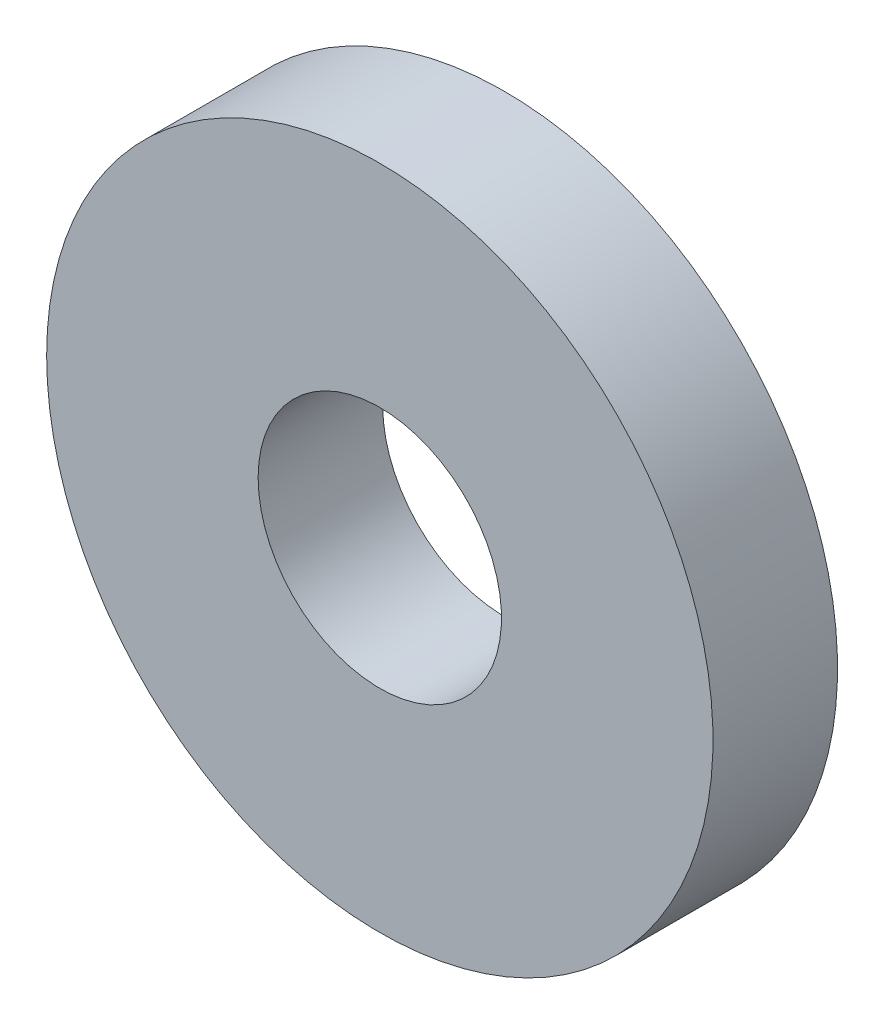
ISO-10303-21;
HEADER;
FILE_DESCRIPTION(('STEP AP214'),'2;1');
FILE_NAME('part.step','',(''),(''),'','','');
FILE_SCHEMA(('AUTOMOTIVE_DESIGN { 1 0 10303 214 1 1 1 1 }'));
ENDSEC;
DATA;
#1=APPLICATION_CONTEXT('core data for automotive mechanical design processes');
#2=APPLICATION_PROTOCOL_DEFINITION('international standard','automotive_design',2000,#1);
#3=PRODUCT_CONTEXT('',#1,'mechanical');
#4=PRODUCT('Part','Part','',(#3));
#5=PRODUCT_RELATED_PRODUCT_CATEGORY('part','',(#4));
#6=PRODUCT_DEFINITION_FORMATION('','',#4);
#7=PRODUCT_DEFINITION_CONTEXT('part definition',#1,'design');
#8=PRODUCT_DEFINITION('design','',#6,#7);
#9=PRODUCT_DEFINITION_SHAPE('','',#8);
#10=(LENGTH_UNIT() NAMED_UNIT(*) SI_UNIT(.MILLI.,.METRE.));
#11=(NAMED_UNIT(*) PLANE_ANGLE_UNIT() SI_UNIT($,.RADIAN.));
#12=(NAMED_UNIT(*) SI_UNIT($,.STERADIAN.) SOLID_ANGLE_UNIT());
#13=UNCERTAINTY_MEASURE_WITH_UNIT(LENGTH_MEASURE(1.E-05),#10,'distance_accuracy_value','');
#14=(GEOMETRIC_REPRESENTATION_CONTEXT(3) GLOBAL_UNCERTAINTY_ASSIGNED_CONTEXT((#13)) GLOBAL_UNIT_ASSIGNED_CONTEXT((#10,
#11,#12)) REPRESENTATION_CONTEXT('',''));
#15=CARTESIAN_POINT('',(0.,0.,0.));
#16=DIRECTION('',(0.,0.,1.));
#17=DIRECTION('',(1.,0.,0.));
#18=AXIS2_PLACEMENT_3D('',#15,#16,#17);
#19=CARTESIAN_POINT('',(0.,0.,4.3));
#20=DIRECTION('',(0.,0.,1.));
#21=DIRECTION('',(1.,0.,0.));
#22=AXIS2_PLACEMENT_3D('',#19,#20,#21);
#23=PLANE('',#22);
#24=CARTESIAN_POINT('',(0.,0.,4.3));
#25=DIRECTION('',(0.,0.,1.));
#26=DIRECTION('',(1.,0.,0.));
#27=AXIS2_PLACEMENT_3D('',#24,#25,#26);
#28=CIRCLE('',#27,11.5);
#29=CARTESIAN_POINT('',(-11.5,0.,4.3));
#30=VERTEX_POINT('',#29);
#31=EDGE_CURVE('E10',#30,#30,#28,.T.);
#32=ORIENTED_EDGE('',*,*,#31,.T.);
#33=EDGE_LOOP('',(#32));
#34=FACE_BOUND('',#33,.T.);
#35=CARTESIAN_POINT('',(0.,0.,4.3));
#36=DIRECTION('',(0.,0.,1.));
#37=DIRECTION('',(1.,0.,0.));
#38=AXIS2_PLACEMENT_3D('',#35,#36,#37);
#39=CIRCLE('',#38,4.2);
#40=CARTESIAN_POINT('',(-4.2,0.,4.3));
#41=VERTEX_POINT('',#40);
#42=EDGE_CURVE('E41',#41,#41,#39,.T.);
#43=ORIENTED_EDGE('',*,*,#42,.F.);
#44=EDGE_LOOP('',(#43));
#45=FACE_BOUND('',#44,.T.);
#46=ADVANCED_FACE('F30',(#34,#45),#23,.T.);
#47=CARTESIAN_POINT('',(0.,0.,0.));
#48=DIRECTION('',(0.,0.,1.));
#49=DIRECTION('',(1.,0.,0.));
#50=AXIS2_PLACEMENT_3D('',#47,#48,#49);
#51=PLANE('',#50);
#52=CARTESIAN_POINT('',(0.,0.,0.));
#53=DIRECTION('',(0.,0.,1.));
#54=DIRECTION('',(1.,0.,0.));
#55=AXIS2_PLACEMENT_3D('',#52,#53,#54);
#56=CIRCLE('',#55,11.5);
#57=CARTESIAN_POINT('',(-11.5,0.,0.));
#58=VERTEX_POINT('',#57);
#59=EDGE_CURVE('E34',#58,#58,#56,.T.);
#60=ORIENTED_EDGE('',*,*,#59,.F.);
#61=EDGE_LOOP('',(#60));
#62=FACE_BOUND('',#61,.T.);
#63=CARTESIAN_POINT('',(0.,0.,0.));
#64=DIRECTION('',(0.,0.,1.));
#65=DIRECTION('',(1.,0.,0.));
#66=AXIS2_PLACEMENT_3D('',#63,#64,#65);
#67=CIRCLE('',#66,4.2);
#68=CARTESIAN_POINT('',(-4.2,0.,0.));
#69=VERTEX_POINT('',#68);
#70=EDGE_CURVE('E43',#69,#69,#67,.T.);
#71=ORIENTED_EDGE('',*,*,#70,.T.);
#72=EDGE_LOOP('',(#71));
#73=FACE_BOUND('',#72,.T.);
#74=ADVANCED_FACE('F53',(#62,#73),#51,.F.);
#75=CARTESIAN_POINT('',(0.,0.,4.3));
#76=DIRECTION('',(0.,0.,-1.));
#77=DIRECTION('',(-1.,0.,0.));
#78=AXIS2_PLACEMENT_3D('',#75,#76,#77);
#79=CYLINDRICAL_SURFACE('',#78,11.5);
#80=CARTESIAN_POINT('',(-11.5,0.,4.3));
#81=CARTESIAN_POINT('',(-11.5,0.,4.25520833333333));
#82=CARTESIAN_POINT('',(-11.5,0.,4.21041666666667));
#83=CARTESIAN_POINT('',(-11.5,0.,4.12083333333333));
#84=CARTESIAN_POINT('',(-11.5,0.,4.07604166666667));
#85=CARTESIAN_POINT('',(-11.5,0.,3.98645833333333));
#86=CARTESIAN_POINT('',(-11.5,0.,3.94166666666667));
#87=CARTESIAN_POINT('',(-11.5,0.,3.85208333333333));
#88=CARTESIAN_POINT('',(-11.5,0.,3.80729166666667));
#89=CARTESIAN_POINT('',(-11.5,0.,3.71770833333333));
#90=CARTESIAN_POINT('',(-11.5,0.,3.67291666666667));
#91=CARTESIAN_POINT('',(-11.5,0.,3.58333333333333));
#92=CARTESIAN_POINT('',(-11.5,0.,3.53854166666667));
#93=CARTESIAN_POINT('',(-11.5,0.,3.44895833333333));
#94=CARTESIAN_POINT('',(-11.5,0.,3.40416666666667));
#95=CARTESIAN_POINT('',(-11.5,0.,3.31458333333333));
#96=CARTESIAN_POINT('',(-11.5,0.,3.26979166666667));
#97=CARTESIAN_POINT('',(-11.5,0.,3.18020833333333));
#98=CARTESIAN_POINT('',(-11.5,0.,3.13541666666667));
#99=CARTESIAN_POINT('',(-11.5,0.,3.04583333333333));
#100=CARTESIAN_POINT('',(-11.5,0.,3.00104166666667));
#101=CARTESIAN_POINT('',(-11.5,0.,2.91145833333333));
#102=CARTESIAN_POINT('',(-11.5,0.,2.86666666666667));
#103=CARTESIAN_POINT('',(-11.5,0.,2.77708333333333));
#104=CARTESIAN_POINT('',(-11.5,0.,2.73229166666667));
#105=CARTESIAN_POINT('',(-11.5,0.,2.64270833333333));
#106=CARTESIAN_POINT('',(-11.5,0.,2.59791666666667));
#107=CARTESIAN_POINT('',(-11.5,0.,2.50833333333333));
#108=CARTESIAN_POINT('',(-11.5,0.,2.46354166666667));
#109=CARTESIAN_POINT('',(-11.5,0.,2.37395833333333));
#110=CARTESIAN_POINT('',(-11.5,0.,2.32916666666667));
#111=CARTESIAN_POINT('',(-11.5,0.,2.23958333333333));
#112=CARTESIAN_POINT('',(-11.5,0.,2.19479166666667));
#113=CARTESIAN_POINT('',(-11.5,0.,2.10520833333333));
#114=CARTESIAN_POINT('',(-11.5,0.,2.06041666666667));
#115=CARTESIAN_POINT('',(-11.5,0.,1.97083333333333));
#116=CARTESIAN_POINT('',(-11.5,0.,1.92604166666667));
#117=CARTESIAN_POINT('',(-11.5,0.,1.83645833333333));
#118=CARTESIAN_POINT('',(-11.5,0.,1.79166666666667));
#119=CARTESIAN_POINT('',(-11.5,0.,1.70208333333333));
#120=CARTESIAN_POINT('',(-11.5,0.,1.65729166666667));
#121=CARTESIAN_POINT('',(-11.5,0.,1.56770833333333));
#122=CARTESIAN_POINT('',(-11.5,0.,1.52291666666667));
#123=CARTESIAN_POINT('',(-11.5,0.,1.43333333333333));
#124=CARTESIAN_POINT('',(-11.5,0.,1.38854166666667));
#125=CARTESIAN_POINT('',(-11.5,0.,1.29895833333333));
#126=CARTESIAN_POINT('',(-11.5,0.,1.25416666666667));
#127=CARTESIAN_POINT('',(-11.5,0.,1.16458333333333));
#128=CARTESIAN_POINT('',(-11.5,0.,1.11979166666667));
#129=CARTESIAN_POINT('',(-11.5,0.,1.03020833333333));
#130=CARTESIAN_POINT('',(-11.5,0.,0.985416666666665));
#131=CARTESIAN_POINT('',(-11.5,0.,0.895833333333332));
#132=CARTESIAN_POINT('',(-11.5,0.,0.851041666666665));
#133=CARTESIAN_POINT('',(-11.5,0.,0.761458333333332));
#134=CARTESIAN_POINT('',(-11.5,0.,0.716666666666665));
#135=CARTESIAN_POINT('',(-11.5,0.,0.627083333333332));
#136=CARTESIAN_POINT('',(-11.5,0.,0.582291666666665));
#137=CARTESIAN_POINT('',(-11.5,0.,0.492708333333332));
#138=CARTESIAN_POINT('',(-11.5,0.,0.447916666666665));
#139=CARTESIAN_POINT('',(-11.5,0.,0.358333333333332));
#140=CARTESIAN_POINT('',(-11.5,0.,0.313541666666666));
#141=CARTESIAN_POINT('',(-11.5,0.,0.223958333333332));
#142=CARTESIAN_POINT('',(-11.5,0.,0.179166666666666));
#143=CARTESIAN_POINT('',(-11.5,0.,0.0895833333333324));
#144=CARTESIAN_POINT('',(-11.5,0.,0.0447916666666658));
#145=CARTESIAN_POINT('',(-11.5,0.,0.));
#146=B_SPLINE_CURVE_WITH_KNOTS('',3,(#80,#81,#82,#83,#84,#85,#86,#87,#88,#89,#90,#91,#92,#93,
#94,#95,#96,#97,#98,#99,#100,#101,#102,#103,#104,#105,#106,#107,#108,#109,#110,#111,#112,#113,
#114,#115,#116,#117,#118,#119,#120,#121,#122,#123,#124,#125,#126,#127,#128,#129,#130,#131,#132,
#133,#134,#135,#136,#137,#138,#139,#140,#141,#142,#143,#144,#145),.UNSPECIFIED.,.F.,.F.,(4,2,2,
2,2,2,2,2,2,2,2,2,2,2,2,2,2,2,2,2,2,2,2,2,2,2,2,2,2,2,2,2,4),(0.,0.134375000000001,
0.268750000000001,0.403125000000001,0.537500000000001,0.671875000000001,0.806250000000001,
0.940625,1.075,1.209375,1.34375,1.478125,1.6125,1.746875,1.88125,2.015625,2.15,2.284375,2.41875,
2.553125,2.6875,2.821875,2.95625,3.090625,3.225,3.359375,3.49375,3.628125,3.7625,3.896875,
4.03125,4.165625,4.3),.UNSPECIFIED.);
#147=EDGE_CURVE('BSEAM32',#30,#58,#146,.T.);
#148=ORIENTED_EDGE('',*,*,#31,.F.);
#149=ORIENTED_EDGE('',*,*,#59,.T.);
#150=ORIENTED_EDGE('',*,*,#147,.T.);
#151=ORIENTED_EDGE('',*,*,#147,.F.);
#152=EDGE_LOOP('',(#148,#150,#149,#151));
#153=FACE_BOUND('',#152,.T.);
#154=ADVANCED_FACE('F32',(#153),#79,.T.);
#155=CARTESIAN_POINT('',(0.,0.,4.3));
#156=DIRECTION('',(0.,0.,-1.));
#157=DIRECTION('',(-1.,0.,0.));
#158=AXIS2_PLACEMENT_3D('',#155,#156,#157);
#159=CYLINDRICAL_SURFACE('',#158,4.2);
#160=CARTESIAN_POINT('',(-4.2,0.,4.3));
#161=CARTESIAN_POINT('',(-4.2,0.,4.25520833333333));
#162=CARTESIAN_POINT('',(-4.2,0.,4.21041666666667));
#163=CARTESIAN_POINT('',(-4.2,0.,4.12083333333333));
#164=CARTESIAN_POINT('',(-4.2,0.,4.07604166666667));
#165=CARTESIAN_POINT('',(-4.2,0.,3.98645833333333));
#166=CARTESIAN_POINT('',(-4.2,0.,3.94166666666667));
#167=CARTESIAN_POINT('',(-4.2,0.,3.85208333333333));
#168=CARTESIAN_POINT('',(-4.2,0.,3.80729166666667));
#169=CARTESIAN_POINT('',(-4.2,0.,3.71770833333333));
#170=CARTESIAN_POINT('',(-4.2,0.,3.67291666666667));
#171=CARTESIAN_POINT('',(-4.2,0.,3.58333333333333));
#172=CARTESIAN_POINT('',(-4.2,0.,3.53854166666667));
#173=CARTESIAN_POINT('',(-4.2,0.,3.44895833333333));
#174=CARTESIAN_POINT('',(-4.2,0.,3.40416666666667));
#175=CARTESIAN_POINT('',(-4.2,0.,3.31458333333333));
#176=CARTESIAN_POINT('',(-4.2,0.,3.26979166666667));
#177=CARTESIAN_POINT('',(-4.2,0.,3.18020833333333));
#178=CARTESIAN_POINT('',(-4.2,0.,3.13541666666667));
#179=CARTESIAN_POINT('',(-4.2,0.,3.04583333333333));
#180=CARTESIAN_POINT('',(-4.2,0.,3.00104166666667));
#181=CARTESIAN_POINT('',(-4.2,0.,2.91145833333333));
#182=CARTESIAN_POINT('',(-4.2,0.,2.86666666666667));
#183=CARTESIAN_POINT('',(-4.2,0.,2.77708333333333));
#184=CARTESIAN_POINT('',(-4.2,0.,2.73229166666667));
#185=CARTESIAN_POINT('',(-4.2,0.,2.64270833333333));
#186=CARTESIAN_POINT('',(-4.2,0.,2.59791666666667));
#187=CARTESIAN_POINT('',(-4.2,0.,2.50833333333333));
#188=CARTESIAN_POINT('',(-4.2,0.,2.46354166666667));
#189=CARTESIAN_POINT('',(-4.2,0.,2.37395833333333));
#190=CARTESIAN_POINT('',(-4.2,0.,2.32916666666667));
#191=CARTESIAN_POINT('',(-4.2,0.,2.23958333333333));
#192=CARTESIAN_POINT('',(-4.2,0.,2.19479166666667));
#193=CARTESIAN_POINT('',(-4.2,0.,2.10520833333333));
#194=CARTESIAN_POINT('',(-4.2,0.,2.06041666666667));
#195=CARTESIAN_POINT('',(-4.2,0.,1.97083333333333));
#196=CARTESIAN_POINT('',(-4.2,0.,1.92604166666667));
#197=CARTESIAN_POINT('',(-4.2,0.,1.83645833333333));
#198=CARTESIAN_POINT('',(-4.2,0.,1.79166666666667));
#199=CARTESIAN_POINT('',(-4.2,0.,1.70208333333333));
#200=CARTESIAN_POINT('',(-4.2,0.,1.65729166666667));
#201=CARTESIAN_POINT('',(-4.2,0.,1.56770833333333));
#202=CARTESIAN_POINT('',(-4.2,0.,1.52291666666667));
#203=CARTESIAN_POINT('',(-4.2,0.,1.43333333333333));
#204=CARTESIAN_POINT('',(-4.2,0.,1.38854166666667));
#205=CARTESIAN_POINT('',(-4.2,0.,1.29895833333333));
#206=CARTESIAN_POINT('',(-4.2,0.,1.25416666666667));
#207=CARTESIAN_POINT('',(-4.2,0.,1.16458333333333));
#208=CARTESIAN_POINT('',(-4.2,0.,1.11979166666667));
#209=CARTESIAN_POINT('',(-4.2,0.,1.03020833333333));
#210=CARTESIAN_POINT('',(-4.2,0.,0.985416666666666));
#211=CARTESIAN_POINT('',(-4.2,0.,0.895833333333333));
#212=CARTESIAN_POINT('',(-4.2,0.,0.851041666666666));
#213=CARTESIAN_POINT('',(-4.2,0.,0.761458333333333));
#214=CARTESIAN_POINT('',(-4.2,0.,0.716666666666666));
#215=CARTESIAN_POINT('',(-4.2,0.,0.627083333333333));
#216=CARTESIAN_POINT('',(-4.2,0.,0.582291666666666));
#217=CARTESIAN_POINT('',(-4.2,0.,0.492708333333333));
#218=CARTESIAN_POINT('',(-4.2,0.,0.447916666666666));
#219=CARTESIAN_POINT('',(-4.2,0.,0.358333333333333));
#220=CARTESIAN_POINT('',(-4.2,0.,0.313541666666666));
#221=CARTESIAN_POINT('',(-4.2,0.,0.223958333333332));
#222=CARTESIAN_POINT('',(-4.2,0.,0.179166666666666));
#223=CARTESIAN_POINT('',(-4.2,0.,0.0895833333333324));
#224=CARTESIAN_POINT('',(-4.2,0.,0.0447916666666658));
#225=CARTESIAN_POINT('',(-4.2,0.,0.));
#226=B_SPLINE_CURVE_WITH_KNOTS('',3,(#160,#161,#162,#163,#164,#165,#166,#167,#168,#169,#170,
#171,#172,#173,#174,#175,#176,#177,#178,#179,#180,#181,#182,#183,#184,#185,#186,#187,#188,#189,
#190,#191,#192,#193,#194,#195,#196,#197,#198,#199,#200,#201,#202,#203,#204,#205,#206,#207,#208,
#209,#210,#211,#212,#213,#214,#215,#216,#217,#218,#219,#220,#221,#222,#223,#224,#225),
.UNSPECIFIED.,.F.,.F.,(4,2,2,2,2,2,2,2,2,2,2,2,2,2,2,2,2,2,2,2,2,2,2,2,2,2,2,2,2,2,2,2,4),(0.,
0.134375,0.26875,0.403124999999999,0.5375,0.671875,0.80625,0.940625,1.075,1.209375,1.34375,
1.478125,1.6125,1.746875,1.88125,2.015625,2.15,2.284375,2.41875,2.553125,2.6875,2.821875,
2.95625,3.090625,3.225,3.359375,3.49375,3.628125,3.7625,3.896875,4.03125,4.165625,4.3),.UNSPECIFIED.);
#227=EDGE_CURVE('BSEAM49',#41,#69,#226,.T.);
#228=ORIENTED_EDGE('',*,*,#42,.T.);
#229=ORIENTED_EDGE('',*,*,#70,.F.);
#230=ORIENTED_EDGE('',*,*,#227,.T.);
#231=ORIENTED_EDGE('',*,*,#227,.F.);
#232=EDGE_LOOP('',(#228,#230,#229,#231));
#233=FACE_BOUND('',#232,.T.);
#234=ADVANCED_FACE('F49',(#233),#159,.F.);
#235=CLOSED_SHELL('',(#46,#74,#154,#234));
#236=MANIFOLD_SOLID_BREP('B2',#235);
#237=ADVANCED_BREP_SHAPE_REPRESENTATION('',(#18,#236),#14);
#238=SHAPE_DEFINITION_REPRESENTATION(#9,#237);
ENDSEC;
END-ISO-10303-21;
